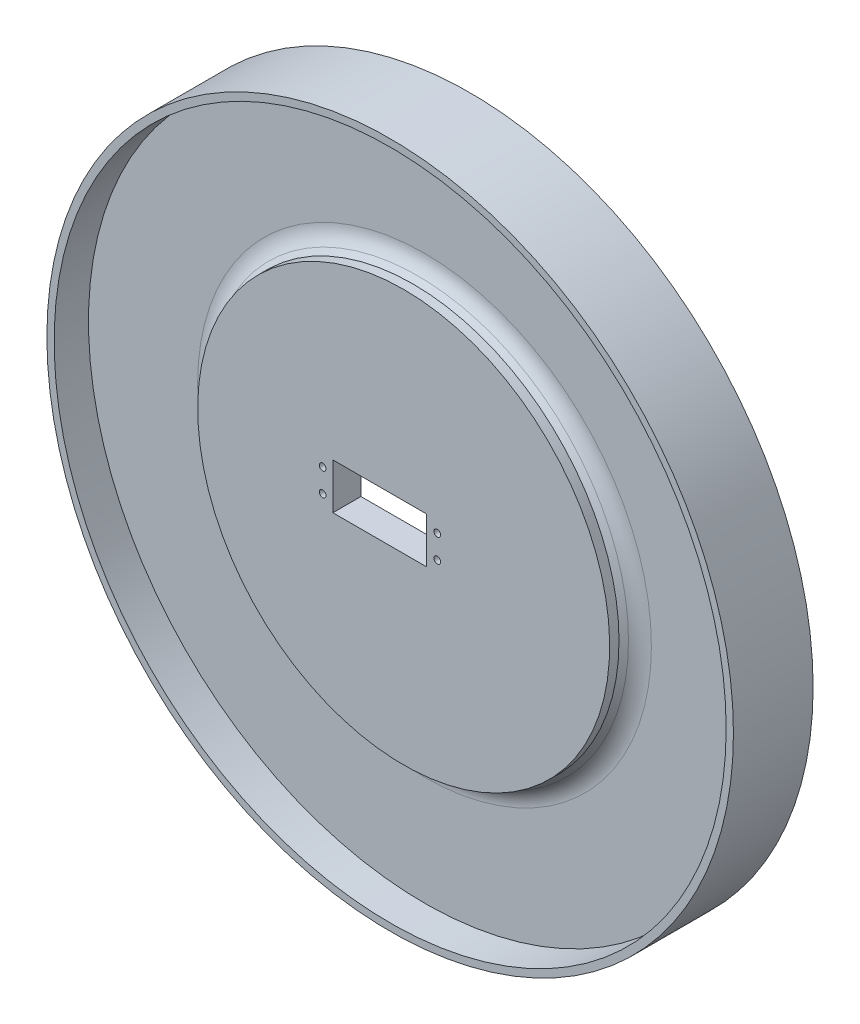
ISO-10303-21;
HEADER;
FILE_DESCRIPTION(('STEP AP214'),'2;1');
FILE_NAME('part.step','',(''),(''),'','','');
FILE_SCHEMA(('AUTOMOTIVE_DESIGN { 1 0 10303 214 1 1 1 1 }'));
ENDSEC;
DATA;
#1=APPLICATION_CONTEXT('core data for automotive mechanical design processes');
#2=APPLICATION_PROTOCOL_DEFINITION('international standard','automotive_design',2000,#1);
#3=PRODUCT_CONTEXT('',#1,'mechanical');
#4=PRODUCT('Part','Part','',(#3));
#5=PRODUCT_RELATED_PRODUCT_CATEGORY('part','',(#4));
#6=PRODUCT_DEFINITION_FORMATION('','',#4);
#7=PRODUCT_DEFINITION_CONTEXT('part definition',#1,'design');
#8=PRODUCT_DEFINITION('design','',#6,#7);
#9=PRODUCT_DEFINITION_SHAPE('','',#8);
#10=(LENGTH_UNIT() NAMED_UNIT(*) SI_UNIT(.MILLI.,.METRE.));
#11=(NAMED_UNIT(*) PLANE_ANGLE_UNIT() SI_UNIT($,.RADIAN.));
#12=(NAMED_UNIT(*) SI_UNIT($,.STERADIAN.) SOLID_ANGLE_UNIT());
#13=UNCERTAINTY_MEASURE_WITH_UNIT(LENGTH_MEASURE(1.E-05),#10,'distance_accuracy_value','');
#14=(GEOMETRIC_REPRESENTATION_CONTEXT(3) GLOBAL_UNCERTAINTY_ASSIGNED_CONTEXT((#13)) GLOBAL_UNIT_ASSIGNED_CONTEXT((#10,
#11,#12)) REPRESENTATION_CONTEXT('',''));
#15=CARTESIAN_POINT('',(0.,0.,0.));
#16=DIRECTION('',(0.,0.,1.));
#17=DIRECTION('',(1.,0.,0.));
#18=AXIS2_PLACEMENT_3D('',#15,#16,#17);
#19=CARTESIAN_POINT('',(0.,0.,-9.09));
#20=DIRECTION('',(0.,0.,1.));
#21=DIRECTION('',(1.,0.,0.));
#22=AXIS2_PLACEMENT_3D('',#19,#20,#21);
#23=PLANE('',#22);
#24=DIRECTION('',(1.,0.,0.));
#25=VECTOR('',#24,1.);
#26=CARTESIAN_POINT('',(-30.94,-10.,-9.09));
#27=LINE('',#26,#25);
#28=CARTESIAN_POINT('',(-30.94,-10.,-9.09));
#29=VERTEX_POINT('',#28);
#30=CARTESIAN_POINT('',(10.06,-10.,-9.09));
#31=VERTEX_POINT('',#30);
#32=EDGE_CURVE('E94',#29,#31,#27,.T.);
#33=ORIENTED_EDGE('',*,*,#32,.T.);
#34=DIRECTION('',(0.,1.,0.));
#35=VECTOR('',#34,1.);
#36=CARTESIAN_POINT('',(10.06,-10.,-9.09));
#37=LINE('',#36,#35);
#38=CARTESIAN_POINT('',(10.06,10.,-9.09));
#39=VERTEX_POINT('',#38);
#40=EDGE_CURVE('E87',#31,#39,#37,.T.);
#41=ORIENTED_EDGE('',*,*,#40,.T.);
#42=DIRECTION('',(-1.,0.,0.));
#43=VECTOR('',#42,1.);
#44=CARTESIAN_POINT('',(-30.94,10.,-9.09));
#45=LINE('',#44,#43);
#46=CARTESIAN_POINT('',(-30.94,10.,-9.09));
#47=VERTEX_POINT('',#46);
#48=EDGE_CURVE('E97',#39,#47,#45,.T.);
#49=ORIENTED_EDGE('',*,*,#48,.T.);
#50=DIRECTION('',(0.,-1.,0.));
#51=VECTOR('',#50,1.);
#52=CARTESIAN_POINT('',(-30.94,-10.,-9.09));
#53=LINE('',#52,#51);
#54=EDGE_CURVE('E59',#47,#29,#53,.T.);
#55=ORIENTED_EDGE('',*,*,#54,.T.);
#56=EDGE_LOOP('',(#33,#41,#49,#55));
#57=FACE_BOUND('',#56,.T.);
#58=CARTESIAN_POINT('',(-35.4195013925818,-5.08,-9.09));
#59=DIRECTION('',(0.,0.,1.));
#60=DIRECTION('',(1.,0.,0.));
#61=AXIS2_PLACEMENT_3D('',#58,#59,#60);
#62=CIRCLE('',#61,1.47);
#63=CARTESIAN_POINT('',(-33.9495013925818,-5.08,-9.09));
#64=VERTEX_POINT('',#63);
#65=EDGE_CURVE('E112',#64,#64,#62,.T.);
#66=ORIENTED_EDGE('',*,*,#65,.T.);
#67=EDGE_LOOP('',(#66));
#68=FACE_BOUND('',#67,.T.);
#69=CARTESIAN_POINT('',(14.6804986074182,5.08000000000001,-9.09));
#70=DIRECTION('',(0.,0.,1.));
#71=DIRECTION('',(1.,0.,0.));
#72=AXIS2_PLACEMENT_3D('',#69,#70,#71);
#73=CIRCLE('',#72,1.47);
#74=CARTESIAN_POINT('',(16.1504986074182,5.08000000000001,-9.09));
#75=VERTEX_POINT('',#74);
#76=EDGE_CURVE('E270',#75,#75,#73,.T.);
#77=ORIENTED_EDGE('',*,*,#76,.T.);
#78=EDGE_LOOP('',(#77));
#79=FACE_BOUND('',#78,.T.);
#80=CARTESIAN_POINT('',(-35.4195013925818,5.08,-9.09));
#81=DIRECTION('',(0.,0.,1.));
#82=DIRECTION('',(1.,0.,0.));
#83=AXIS2_PLACEMENT_3D('',#80,#81,#82);
#84=CIRCLE('',#83,1.47);
#85=CARTESIAN_POINT('',(-33.9495013925818,5.08,-9.09));
#86=VERTEX_POINT('',#85);
#87=EDGE_CURVE('E265',#86,#86,#84,.T.);
#88=ORIENTED_EDGE('',*,*,#87,.T.);
#89=EDGE_LOOP('',(#88));
#90=FACE_BOUND('',#89,.T.);
#91=CARTESIAN_POINT('',(14.6804986074182,-5.08,-9.09));
#92=DIRECTION('',(0.,0.,1.));
#93=DIRECTION('',(1.,0.,0.));
#94=AXIS2_PLACEMENT_3D('',#91,#92,#93);
#95=CIRCLE('',#94,1.47);
#96=CARTESIAN_POINT('',(16.1504986074182,-5.08,-9.09));
#97=VERTEX_POINT('',#96);
#98=EDGE_CURVE('E262',#97,#97,#95,.T.);
#99=ORIENTED_EDGE('',*,*,#98,.T.);
#100=EDGE_LOOP('',(#99));
#101=FACE_BOUND('',#100,.T.);
#102=CARTESIAN_POINT('',(0.,0.,-9.09));
#103=DIRECTION('',(0.,0.,-1.));
#104=DIRECTION('',(-1.,0.,0.));
#105=AXIS2_PLACEMENT_3D('',#102,#103,#104);
#106=CIRCLE('',#105,120.);
#107=CARTESIAN_POINT('',(-120.,0.,-9.09));
#108=VERTEX_POINT('',#107);
#109=EDGE_CURVE('E280',#108,#108,#106,.T.);
#110=ORIENTED_EDGE('',*,*,#109,.T.);
#111=EDGE_LOOP('',(#110));
#112=FACE_BOUND('',#111,.T.);
#113=ADVANCED_FACE('F41',(#57,#68,#79,#90,#101,#112),#23,.F.);
#114=CARTESIAN_POINT('',(0.,0.,9.09));
#115=DIRECTION('',(0.,0.,-1.));
#116=DIRECTION('',(-1.,0.,0.));
#117=AXIS2_PLACEMENT_3D('',#114,#115,#116);
#118=CYLINDRICAL_SURFACE('',#117,90.);
#119=CARTESIAN_POINT('',(0.,0.,3.18000000000005));
#120=DIRECTION('',(0.,0.,-1.));
#121=DIRECTION('',(0.,1.,0.));
#122=AXIS2_PLACEMENT_3D('',#119,#120,#121);
#123=CIRCLE('',#122,90.);
#124=CARTESIAN_POINT('',(0.,90.,3.18));
#125=VERTEX_POINT('',#124);
#126=EDGE_CURVE('E130',#125,#125,#123,.T.);
#127=ORIENTED_EDGE('',*,*,#126,.T.);
#128=EDGE_LOOP('',(#127));
#129=FACE_BOUND('',#128,.T.);
#130=CARTESIAN_POINT('',(0.,0.,-0.91000000000001));
#131=DIRECTION('',(0.,0.,1.));
#132=DIRECTION('',(1.,0.,0.));
#133=AXIS2_PLACEMENT_3D('',#130,#131,#132);
#134=CIRCLE('',#133,90.);
#135=CARTESIAN_POINT('',(90.,0.,-0.91000000000001));
#136=VERTEX_POINT('',#135);
#137=EDGE_CURVE('E141',#136,#136,#134,.T.);
#138=ORIENTED_EDGE('',*,*,#137,.T.);
#139=EDGE_LOOP('',(#138));
#140=FACE_BOUND('',#139,.T.);
#141=ADVANCED_FACE('F43',(#129,#140),#118,.T.);
#142=CARTESIAN_POINT('',(0.,0.,9.09));
#143=DIRECTION('',(0.,0.,-1.));
#144=DIRECTION('',(-1.,0.,0.));
#145=AXIS2_PLACEMENT_3D('',#142,#143,#144);
#146=CYLINDRICAL_SURFACE('',#145,150.);
#147=CARTESIAN_POINT('',(0.,0.,9.09));
#148=DIRECTION('',(0.,0.,1.));
#149=DIRECTION('',(1.,0.,0.));
#150=AXIS2_PLACEMENT_3D('',#147,#148,#149);
#151=CIRCLE('',#150,150.);
#152=CARTESIAN_POINT('',(150.,0.,9.09));
#153=VERTEX_POINT('',#152);
#154=EDGE_CURVE('E145',#153,#153,#151,.T.);
#155=ORIENTED_EDGE('',*,*,#154,.F.);
#156=EDGE_LOOP('',(#155));
#157=FACE_BOUND('',#156,.T.);
#158=CARTESIAN_POINT('',(0.,0.,-25.73));
#159=DIRECTION('',(0.,0.,-1.));
#160=DIRECTION('',(-1.,0.,0.));
#161=AXIS2_PLACEMENT_3D('',#158,#159,#160);
#162=CIRCLE('',#161,150.);
#163=CARTESIAN_POINT('',(-150.,0.,-25.73));
#164=VERTEX_POINT('',#163);
#165=EDGE_CURVE('E275',#164,#164,#162,.T.);
#166=ORIENTED_EDGE('',*,*,#165,.F.);
#167=EDGE_LOOP('',(#166));
#168=FACE_BOUND('',#167,.T.);
#169=ADVANCED_FACE('F199',(#157,#168),#146,.T.);
#170=CARTESIAN_POINT('',(0.,0.,9.09));
#171=DIRECTION('',(0.,0.,1.));
#172=DIRECTION('',(1.,0.,0.));
#173=AXIS2_PLACEMENT_3D('',#170,#171,#172);
#174=PLANE('',#173);
#175=CARTESIAN_POINT('',(0.,0.,9.09));
#176=DIRECTION('',(0.,0.,1.));
#177=DIRECTION('',(1.,0.,0.));
#178=AXIS2_PLACEMENT_3D('',#175,#176,#177);
#179=CIRCLE('',#178,146.82);
#180=CARTESIAN_POINT('',(146.82,0.,9.09));
#181=VERTEX_POINT('',#180);
#182=EDGE_CURVE('E140',#181,#181,#179,.T.);
#183=ORIENTED_EDGE('',*,*,#182,.F.);
#184=EDGE_LOOP('',(#183));
#185=FACE_BOUND('',#184,.T.);
#186=ORIENTED_EDGE('',*,*,#154,.T.);
#187=EDGE_LOOP('',(#186));
#188=FACE_BOUND('',#187,.T.);
#189=ADVANCED_FACE('F204',(#185,#188),#174,.T.);
#190=CARTESIAN_POINT('',(0.,0.,-5.91));
#191=DIRECTION('',(0.,0.,1.));
#192=DIRECTION('',(1.,0.,0.));
#193=AXIS2_PLACEMENT_3D('',#190,#191,#192);
#194=CYLINDRICAL_SURFACE('',#193,146.82);
#195=CARTESIAN_POINT('',(0.,0.,-5.91));
#196=DIRECTION('',(0.,0.,1.));
#197=DIRECTION('',(1.,0.,0.));
#198=AXIS2_PLACEMENT_3D('',#195,#196,#197);
#199=CIRCLE('',#198,146.82);
#200=CARTESIAN_POINT('',(146.82,0.,-5.91));
#201=VERTEX_POINT('',#200);
#202=EDGE_CURVE('E51',#201,#201,#199,.T.);
#203=ORIENTED_EDGE('',*,*,#202,.F.);
#204=EDGE_LOOP('',(#203));
#205=FACE_BOUND('',#204,.T.);
#206=ORIENTED_EDGE('',*,*,#182,.T.);
#207=EDGE_LOOP('',(#206));
#208=FACE_BOUND('',#207,.T.);
#209=ADVANCED_FACE('F207',(#205,#208),#194,.F.);
#210=CARTESIAN_POINT('',(0.,0.,-5.91));
#211=DIRECTION('',(0.,0.,1.));
#212=DIRECTION('',(1.,0.,0.));
#213=AXIS2_PLACEMENT_3D('',#210,#211,#212);
#214=PLANE('',#213);
#215=CARTESIAN_POINT('',(0.,0.,-5.91));
#216=DIRECTION('',(0.,0.,1.));
#217=DIRECTION('',(1.,0.,0.));
#218=AXIS2_PLACEMENT_3D('',#215,#216,#217);
#219=CIRCLE('',#218,99.1421356237309);
#220=CARTESIAN_POINT('',(99.1421356237309,0.,-5.91));
#221=VERTEX_POINT('',#220);
#222=EDGE_CURVE('E136',#221,#221,#219,.F.);
#223=ORIENTED_EDGE('',*,*,#222,.T.);
#224=EDGE_LOOP('',(#223));
#225=FACE_BOUND('',#224,.T.);
#226=ORIENTED_EDGE('',*,*,#202,.T.);
#227=EDGE_LOOP('',(#226));
#228=FACE_BOUND('',#227,.T.);
#229=ADVANCED_FACE('F211',(#225,#228),#214,.T.);
#230=CARTESIAN_POINT('',(0.,0.,-0.91000000000001));
#231=DIRECTION('',(0.,0.,-1.));
#232=DIRECTION('',(-1.,0.,0.));
#233=AXIS2_PLACEMENT_3D('',#230,#231,#232);
#234=CONICAL_SURFACE('',#233,90.,0.78539816339744);
#235=CARTESIAN_POINT('',(0.,0.,-2.98106781186543));
#236=DIRECTION('',(0.,0.,1.));
#237=DIRECTION('',(1.,0.,0.));
#238=AXIS2_PLACEMENT_3D('',#235,#236,#237);
#239=CIRCLE('',#238,92.0710678118654);
#240=CARTESIAN_POINT('',(92.0710678118654,0.,-2.98106781186543));
#241=VERTEX_POINT('',#240);
#242=EDGE_CURVE('E11',#241,#241,#239,.T.);
#243=ORIENTED_EDGE('',*,*,#242,.T.);
#244=EDGE_LOOP('',(#243));
#245=FACE_BOUND('',#244,.T.);
#246=ORIENTED_EDGE('',*,*,#137,.F.);
#247=EDGE_LOOP('',(#246));
#248=FACE_BOUND('',#247,.T.);
#249=ADVANCED_FACE('F214',(#245,#248),#234,.T.);
#250=CARTESIAN_POINT('',(0.,0.,4.09));
#251=DIRECTION('',(0.,0.,1.));
#252=DIRECTION('',(1.,0.,0.));
#253=AXIS2_PLACEMENT_3D('',#250,#251,#252);
#254=TOROIDAL_SURFACE('',#253,99.1421356237309,10.);
#255=ORIENTED_EDGE('',*,*,#242,.F.);
#256=EDGE_LOOP('',(#255));
#257=FACE_BOUND('',#256,.T.);
#258=ORIENTED_EDGE('',*,*,#222,.F.);
#259=EDGE_LOOP('',(#258));
#260=FACE_BOUND('',#259,.T.);
#261=ADVANCED_FACE('F217',(#257,#260),#254,.F.);
#262=CARTESIAN_POINT('',(0.,90.,3.17999999999996));
#263=DIRECTION('',(0.,0.,-1.));
#264=DIRECTION('',(0.,1.,0.));
#265=AXIS2_PLACEMENT_3D('',#262,#263,#264);
#266=PLANE('',#265);
#267=CARTESIAN_POINT('',(14.6804986074182,-5.08,3.18000000000002));
#268=DIRECTION('',(0.,0.,-1.));
#269=DIRECTION('',(0.,1.,0.));
#270=AXIS2_PLACEMENT_3D('',#267,#268,#269);
#271=CIRCLE('',#270,1.47);
#272=CARTESIAN_POINT('',(14.6804986074182,-3.61,3.18000000000002));
#273=VERTEX_POINT('',#272);
#274=EDGE_CURVE('E45',#273,#273,#271,.T.);
#275=ORIENTED_EDGE('',*,*,#274,.T.);
#276=EDGE_LOOP('',(#275));
#277=FACE_BOUND('',#276,.T.);
#278=CARTESIAN_POINT('',(-35.4195013925818,5.08,3.18000000000001));
#279=DIRECTION('',(0.,0.,-1.));
#280=DIRECTION('',(0.,1.,0.));
#281=AXIS2_PLACEMENT_3D('',#278,#279,#280);
#282=CIRCLE('',#281,1.47);
#283=CARTESIAN_POINT('',(-35.4195013925818,6.55,3.18000000000001));
#284=VERTEX_POINT('',#283);
#285=EDGE_CURVE('E165',#284,#284,#282,.T.);
#286=ORIENTED_EDGE('',*,*,#285,.T.);
#287=EDGE_LOOP('',(#286));
#288=FACE_BOUND('',#287,.T.);
#289=CARTESIAN_POINT('',(14.6804986074182,5.08000000000001,3.18000000000001));
#290=DIRECTION('',(0.,0.,-1.));
#291=DIRECTION('',(0.,1.,0.));
#292=AXIS2_PLACEMENT_3D('',#289,#290,#291);
#293=CIRCLE('',#292,1.47);
#294=CARTESIAN_POINT('',(14.6804986074182,6.55000000000001,3.18000000000001));
#295=VERTEX_POINT('',#294);
#296=EDGE_CURVE('E162',#295,#295,#293,.T.);
#297=ORIENTED_EDGE('',*,*,#296,.T.);
#298=EDGE_LOOP('',(#297));
#299=FACE_BOUND('',#298,.T.);
#300=CARTESIAN_POINT('',(-35.4195013925818,-5.08,3.18000000000002));
#301=DIRECTION('',(0.,0.,-1.));
#302=DIRECTION('',(0.,1.,0.));
#303=AXIS2_PLACEMENT_3D('',#300,#301,#302);
#304=CIRCLE('',#303,1.47);
#305=CARTESIAN_POINT('',(-35.4195013925818,-3.61,3.18000000000002));
#306=VERTEX_POINT('',#305);
#307=EDGE_CURVE('E158',#306,#306,#304,.T.);
#308=ORIENTED_EDGE('',*,*,#307,.T.);
#309=EDGE_LOOP('',(#308));
#310=FACE_BOUND('',#309,.T.);
#311=DIRECTION('',(-1.,0.,0.));
#312=VECTOR('',#311,1.);
#313=CARTESIAN_POINT('',(-30.94,10.,3.18000000000002));
#314=LINE('',#313,#312);
#315=CARTESIAN_POINT('',(10.06,10.,3.18000000000001));
#316=VERTEX_POINT('',#315);
#317=CARTESIAN_POINT('',(-30.94,10.,3.18000000000002));
#318=VERTEX_POINT('',#317);
#319=EDGE_CURVE('E121',#316,#318,#314,.T.);
#320=ORIENTED_EDGE('',*,*,#319,.F.);
#321=DIRECTION('',(0.,1.,0.));
#322=VECTOR('',#321,1.);
#323=CARTESIAN_POINT('',(10.06,-10.,3.18000000000002));
#324=LINE('',#323,#322);
#325=CARTESIAN_POINT('',(10.06,-10.,3.18000000000002));
#326=VERTEX_POINT('',#325);
#327=EDGE_CURVE('E67',#326,#316,#324,.T.);
#328=ORIENTED_EDGE('',*,*,#327,.F.);
#329=DIRECTION('',(1.,0.,0.));
#330=VECTOR('',#329,1.);
#331=CARTESIAN_POINT('',(-30.94,-10.,3.18000000000002));
#332=LINE('',#331,#330);
#333=CARTESIAN_POINT('',(-30.94,-10.,3.18000000000002));
#334=VERTEX_POINT('',#333);
#335=EDGE_CURVE('E105',#334,#326,#332,.T.);
#336=ORIENTED_EDGE('',*,*,#335,.F.);
#337=DIRECTION('',(0.,-1.,0.));
#338=VECTOR('',#337,1.);
#339=CARTESIAN_POINT('',(-30.94,-10.,3.18000000000002));
#340=LINE('',#339,#338);
#341=EDGE_CURVE('E109',#318,#334,#340,.T.);
#342=ORIENTED_EDGE('',*,*,#341,.F.);
#343=EDGE_LOOP('',(#320,#328,#336,#342));
#344=FACE_BOUND('',#343,.T.);
#345=ORIENTED_EDGE('',*,*,#126,.F.);
#346=EDGE_LOOP('',(#345));
#347=FACE_BOUND('',#346,.T.);
#348=ADVANCED_FACE('F174',(#277,#288,#299,#310,#344,#347),#266,.F.);
#349=CARTESIAN_POINT('',(10.06,-10.,-9.09));
#350=DIRECTION('',(1.,0.,0.));
#351=DIRECTION('',(0.,1.,0.));
#352=AXIS2_PLACEMENT_3D('',#349,#350,#351);
#353=PLANE('',#352);
#354=ORIENTED_EDGE('',*,*,#327,.T.);
#355=DIRECTION('',(0.,0.,1.));
#356=VECTOR('',#355,1.);
#357=CARTESIAN_POINT('',(10.06,10.,-9.09));
#358=LINE('',#357,#356);
#359=EDGE_CURVE('E83',#39,#316,#358,.T.);
#360=ORIENTED_EDGE('',*,*,#359,.F.);
#361=ORIENTED_EDGE('',*,*,#40,.F.);
#362=DIRECTION('',(0.,0.,1.));
#363=VECTOR('',#362,1.);
#364=CARTESIAN_POINT('',(10.06,-10.,-9.09));
#365=LINE('',#364,#363);
#366=EDGE_CURVE('E127',#31,#326,#365,.T.);
#367=ORIENTED_EDGE('',*,*,#366,.T.);
#368=EDGE_LOOP('',(#354,#360,#361,#367));
#369=FACE_BOUND('',#368,.T.);
#370=ADVANCED_FACE('F85',(#369),#353,.F.);
#371=CARTESIAN_POINT('',(-30.94,-10.,-9.09));
#372=DIRECTION('',(0.,-1.,0.));
#373=DIRECTION('',(0.,0.,-1.));
#374=AXIS2_PLACEMENT_3D('',#371,#372,#373);
#375=PLANE('',#374);
#376=ORIENTED_EDGE('',*,*,#335,.T.);
#377=ORIENTED_EDGE('',*,*,#366,.F.);
#378=ORIENTED_EDGE('',*,*,#32,.F.);
#379=DIRECTION('',(0.,0.,1.));
#380=VECTOR('',#379,1.);
#381=CARTESIAN_POINT('',(-30.94,-10.,-9.09));
#382=LINE('',#381,#380);
#383=EDGE_CURVE('E131',#29,#334,#382,.T.);
#384=ORIENTED_EDGE('',*,*,#383,.T.);
#385=EDGE_LOOP('',(#376,#377,#378,#384));
#386=FACE_BOUND('',#385,.T.);
#387=ADVANCED_FACE('F222',(#386),#375,.F.);
#388=CARTESIAN_POINT('',(-30.94,-10.,-9.09));
#389=DIRECTION('',(-1.,0.,0.));
#390=DIRECTION('',(0.,-1.,0.));
#391=AXIS2_PLACEMENT_3D('',#388,#389,#390);
#392=PLANE('',#391);
#393=ORIENTED_EDGE('',*,*,#341,.T.);
#394=ORIENTED_EDGE('',*,*,#383,.F.);
#395=ORIENTED_EDGE('',*,*,#54,.F.);
#396=DIRECTION('',(0.,0.,1.));
#397=VECTOR('',#396,1.);
#398=CARTESIAN_POINT('',(-30.94,10.,-9.09));
#399=LINE('',#398,#397);
#400=EDGE_CURVE('E93',#47,#318,#399,.T.);
#401=ORIENTED_EDGE('',*,*,#400,.T.);
#402=EDGE_LOOP('',(#393,#394,#395,#401));
#403=FACE_BOUND('',#402,.T.);
#404=ADVANCED_FACE('F236',(#403),#392,.F.);
#405=CARTESIAN_POINT('',(-30.94,10.,-9.09));
#406=DIRECTION('',(0.,1.,0.));
#407=DIRECTION('',(-1.,0.,0.));
#408=AXIS2_PLACEMENT_3D('',#405,#406,#407);
#409=PLANE('',#408);
#410=ORIENTED_EDGE('',*,*,#319,.T.);
#411=ORIENTED_EDGE('',*,*,#400,.F.);
#412=ORIENTED_EDGE('',*,*,#48,.F.);
#413=ORIENTED_EDGE('',*,*,#359,.T.);
#414=EDGE_LOOP('',(#410,#411,#412,#413));
#415=FACE_BOUND('',#414,.T.);
#416=ADVANCED_FACE('F98',(#415),#409,.F.);
#417=CARTESIAN_POINT('',(-35.4195013925818,-5.08,-9.09));
#418=DIRECTION('',(0.,0.,1.));
#419=DIRECTION('',(1.,0.,0.));
#420=AXIS2_PLACEMENT_3D('',#417,#418,#419);
#421=CYLINDRICAL_SURFACE('',#420,1.47);
#422=ORIENTED_EDGE('',*,*,#65,.F.);
#423=EDGE_LOOP('',(#422));
#424=FACE_BOUND('',#423,.T.);
#425=ORIENTED_EDGE('',*,*,#307,.F.);
#426=EDGE_LOOP('',(#425));
#427=FACE_BOUND('',#426,.T.);
#428=ADVANCED_FACE('F235',(#424,#427),#421,.F.);
#429=CARTESIAN_POINT('',(14.6804986074182,5.08000000000001,-9.09));
#430=DIRECTION('',(0.,0.,1.));
#431=DIRECTION('',(1.,0.,0.));
#432=AXIS2_PLACEMENT_3D('',#429,#430,#431);
#433=CYLINDRICAL_SURFACE('',#432,1.47);
#434=ORIENTED_EDGE('',*,*,#76,.F.);
#435=EDGE_LOOP('',(#434));
#436=FACE_BOUND('',#435,.T.);
#437=ORIENTED_EDGE('',*,*,#296,.F.);
#438=EDGE_LOOP('',(#437));
#439=FACE_BOUND('',#438,.T.);
#440=ADVANCED_FACE('F189',(#436,#439),#433,.F.);
#441=CARTESIAN_POINT('',(-35.4195013925818,5.08,-9.09));
#442=DIRECTION('',(0.,0.,1.));
#443=DIRECTION('',(1.,0.,0.));
#444=AXIS2_PLACEMENT_3D('',#441,#442,#443);
#445=CYLINDRICAL_SURFACE('',#444,1.47);
#446=ORIENTED_EDGE('',*,*,#87,.F.);
#447=EDGE_LOOP('',(#446));
#448=FACE_BOUND('',#447,.T.);
#449=ORIENTED_EDGE('',*,*,#285,.F.);
#450=EDGE_LOOP('',(#449));
#451=FACE_BOUND('',#450,.T.);
#452=ADVANCED_FACE('F179',(#448,#451),#445,.F.);
#453=CARTESIAN_POINT('',(14.6804986074182,-5.08,-9.09));
#454=DIRECTION('',(0.,0.,1.));
#455=DIRECTION('',(1.,0.,0.));
#456=AXIS2_PLACEMENT_3D('',#453,#454,#455);
#457=CYLINDRICAL_SURFACE('',#456,1.47);
#458=ORIENTED_EDGE('',*,*,#98,.F.);
#459=EDGE_LOOP('',(#458));
#460=FACE_BOUND('',#459,.T.);
#461=ORIENTED_EDGE('',*,*,#274,.F.);
#462=EDGE_LOOP('',(#461));
#463=FACE_BOUND('',#462,.T.);
#464=ADVANCED_FACE('F176',(#460,#463),#457,.F.);
#465=CARTESIAN_POINT('',(0.,0.,-25.73));
#466=DIRECTION('',(0.,0.,-1.));
#467=DIRECTION('',(-1.,0.,0.));
#468=AXIS2_PLACEMENT_3D('',#465,#466,#467);
#469=PLANE('',#468);
#470=ORIENTED_EDGE('',*,*,#165,.T.);
#471=EDGE_LOOP('',(#470));
#472=FACE_BOUND('',#471,.T.);
#473=CARTESIAN_POINT('',(0.,0.,-25.73));
#474=DIRECTION('',(0.,0.,-1.));
#475=DIRECTION('',(-1.,0.,0.));
#476=AXIS2_PLACEMENT_3D('',#473,#474,#475);
#477=CIRCLE('',#476,120.);
#478=CARTESIAN_POINT('',(-120.,0.,-25.73));
#479=VERTEX_POINT('',#478);
#480=EDGE_CURVE('E279',#479,#479,#477,.T.);
#481=ORIENTED_EDGE('',*,*,#480,.F.);
#482=EDGE_LOOP('',(#481));
#483=FACE_BOUND('',#482,.T.);
#484=ADVANCED_FACE('F178',(#472,#483),#469,.T.);
#485=CARTESIAN_POINT('',(0.,0.,-25.73));
#486=DIRECTION('',(0.,0.,1.));
#487=DIRECTION('',(1.,0.,0.));
#488=AXIS2_PLACEMENT_3D('',#485,#486,#487);
#489=CYLINDRICAL_SURFACE('',#488,120.);
#490=ORIENTED_EDGE('',*,*,#480,.T.);
#491=EDGE_LOOP('',(#490));
#492=FACE_BOUND('',#491,.T.);
#493=ORIENTED_EDGE('',*,*,#109,.F.);
#494=EDGE_LOOP('',(#493));
#495=FACE_BOUND('',#494,.T.);
#496=ADVANCED_FACE('F186',(#492,#495),#489,.F.);
#497=CLOSED_SHELL('',(#113,#141,#169,#189,#209,#229,#249,#261,#348,#370,#387,#404,#416,#428,
#440,#452,#464,#484,#496));
#498=MANIFOLD_SOLID_BREP('B2',#497);
#499=ADVANCED_BREP_SHAPE_REPRESENTATION('',(#18,#498),#14);
#500=SHAPE_DEFINITION_REPRESENTATION(#9,#499);
ENDSEC;
END-ISO-10303-21;
